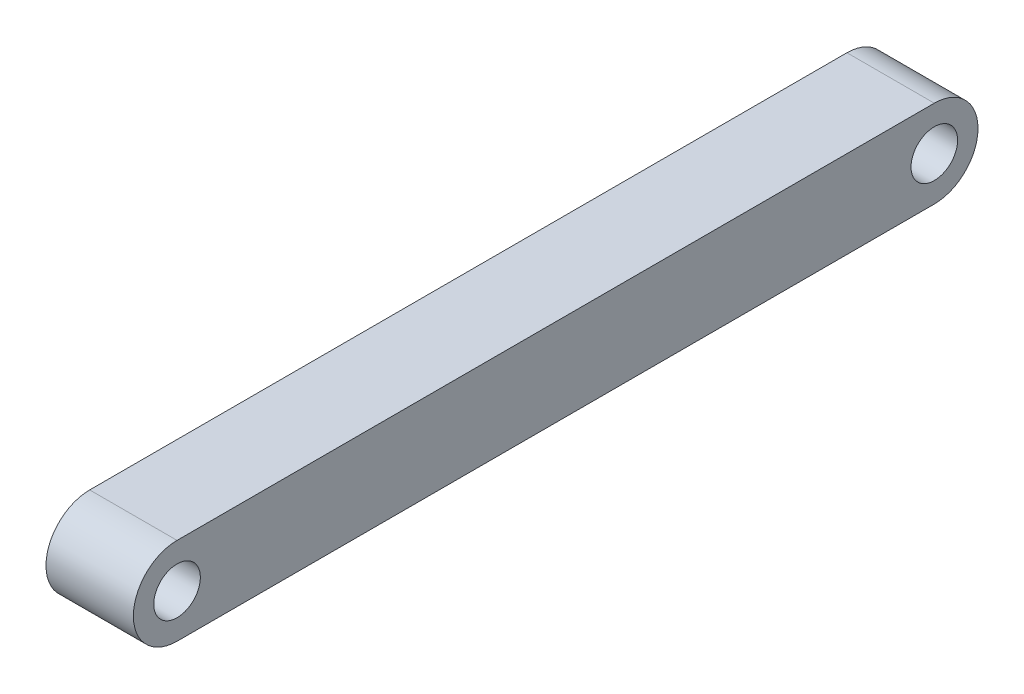
ISO-10303-21;
HEADER;
FILE_DESCRIPTION(('STEP AP214'),'2;1');
FILE_NAME('part.step','',(''),(''),'','','');
FILE_SCHEMA(('AUTOMOTIVE_DESIGN { 1 0 10303 214 1 1 1 1 }'));
ENDSEC;
DATA;
#1=APPLICATION_CONTEXT('core data for automotive mechanical design processes');
#2=APPLICATION_PROTOCOL_DEFINITION('international standard','automotive_design',2000,#1);
#3=PRODUCT_CONTEXT('',#1,'mechanical');
#4=PRODUCT('Part','Part','',(#3));
#5=PRODUCT_RELATED_PRODUCT_CATEGORY('part','',(#4));
#6=PRODUCT_DEFINITION_FORMATION('','',#4);
#7=PRODUCT_DEFINITION_CONTEXT('part definition',#1,'design');
#8=PRODUCT_DEFINITION('design','',#6,#7);
#9=PRODUCT_DEFINITION_SHAPE('','',#8);
#10=(LENGTH_UNIT() NAMED_UNIT(*) SI_UNIT(.MILLI.,.METRE.));
#11=(NAMED_UNIT(*) PLANE_ANGLE_UNIT() SI_UNIT($,.RADIAN.));
#12=(NAMED_UNIT(*) SI_UNIT($,.STERADIAN.) SOLID_ANGLE_UNIT());
#13=UNCERTAINTY_MEASURE_WITH_UNIT(LENGTH_MEASURE(1.E-05),#10,'distance_accuracy_value','');
#14=(GEOMETRIC_REPRESENTATION_CONTEXT(3) GLOBAL_UNCERTAINTY_ASSIGNED_CONTEXT((#13)) GLOBAL_UNIT_ASSIGNED_CONTEXT((#10,
#11,#12)) REPRESENTATION_CONTEXT('',''));
#15=CARTESIAN_POINT('',(0.,0.,0.));
#16=DIRECTION('',(0.,0.,1.));
#17=DIRECTION('',(1.,0.,0.));
#18=AXIS2_PLACEMENT_3D('',#15,#16,#17);
#19=CARTESIAN_POINT('',(7.5,0.,65.));
#20=DIRECTION('',(1.,0.,0.));
#21=DIRECTION('',(0.,0.,-1.));
#22=AXIS2_PLACEMENT_3D('',#19,#20,#21);
#23=PLANE('',#22);
#24=CARTESIAN_POINT('',(7.5,0.,65.));
#25=DIRECTION('',(1.,0.,0.));
#26=DIRECTION('',(0.,0.,-1.));
#27=AXIS2_PLACEMENT_3D('',#24,#25,#26);
#28=CIRCLE('',#27,4.);
#29=CARTESIAN_POINT('',(7.5,0.,61.));
#30=VERTEX_POINT('',#29);
#31=EDGE_CURVE('E112',#30,#30,#28,.T.);
#32=ORIENTED_EDGE('',*,*,#31,.F.);
#33=EDGE_LOOP('',(#32));
#34=FACE_BOUND('',#33,.T.);
#35=CARTESIAN_POINT('',(7.5,0.,65.));
#36=DIRECTION('',(1.,0.,0.));
#37=DIRECTION('',(0.,0.,-1.));
#38=AXIS2_PLACEMENT_3D('',#35,#36,#37);
#39=CIRCLE('',#38,7.5);
#40=CARTESIAN_POINT('',(7.5,7.5,65.));
#41=VERTEX_POINT('',#40);
#42=CARTESIAN_POINT('',(7.5,-7.5,65.));
#43=VERTEX_POINT('',#42);
#44=EDGE_CURVE('E92',#41,#43,#39,.T.);
#45=ORIENTED_EDGE('',*,*,#44,.T.);
#46=DIRECTION('',(0.,0.,-1.));
#47=VECTOR('',#46,1.);
#48=CARTESIAN_POINT('',(7.5,-7.5,65.));
#49=LINE('',#48,#47);
#50=CARTESIAN_POINT('',(7.5,-7.49999999999998,-65.));
#51=VERTEX_POINT('',#50);
#52=EDGE_CURVE('E87',#43,#51,#49,.T.);
#53=ORIENTED_EDGE('',*,*,#52,.T.);
#54=CARTESIAN_POINT('',(7.5,0.,-65.));
#55=DIRECTION('',(1.,0.,0.));
#56=DIRECTION('',(0.,0.,-1.));
#57=AXIS2_PLACEMENT_3D('',#54,#55,#56);
#58=CIRCLE('',#57,7.5);
#59=CARTESIAN_POINT('',(7.5,7.50000000000002,-65.));
#60=VERTEX_POINT('',#59);
#61=EDGE_CURVE('E90',#51,#60,#58,.T.);
#62=ORIENTED_EDGE('',*,*,#61,.T.);
#63=DIRECTION('',(0.,0.,1.));
#64=VECTOR('',#63,1.);
#65=CARTESIAN_POINT('',(7.5,7.5,65.));
#66=LINE('',#65,#64);
#67=EDGE_CURVE('E57',#60,#41,#66,.T.);
#68=ORIENTED_EDGE('',*,*,#67,.T.);
#69=EDGE_LOOP('',(#45,#53,#62,#68));
#70=FACE_BOUND('',#69,.T.);
#71=CARTESIAN_POINT('',(7.5,0.,-65.));
#72=DIRECTION('',(1.,0.,0.));
#73=DIRECTION('',(0.,0.,-1.));
#74=AXIS2_PLACEMENT_3D('',#71,#72,#73);
#75=CIRCLE('',#74,4.00000000000001);
#76=CARTESIAN_POINT('',(7.5,0.,-69.));
#77=VERTEX_POINT('',#76);
#78=EDGE_CURVE('E134',#77,#77,#75,.T.);
#79=ORIENTED_EDGE('',*,*,#78,.F.);
#80=EDGE_LOOP('',(#79));
#81=FACE_BOUND('',#80,.T.);
#82=ADVANCED_FACE('F39',(#34,#70,#81),#23,.T.);
#83=CARTESIAN_POINT('',(-7.5,0.,65.));
#84=DIRECTION('',(1.,0.,0.));
#85=DIRECTION('',(0.,0.,-1.));
#86=AXIS2_PLACEMENT_3D('',#83,#84,#85);
#87=PLANE('',#86);
#88=CARTESIAN_POINT('',(-7.5,0.,65.));
#89=DIRECTION('',(1.,0.,0.));
#90=DIRECTION('',(0.,0.,-1.));
#91=AXIS2_PLACEMENT_3D('',#88,#89,#90);
#92=CIRCLE('',#91,7.5);
#93=CARTESIAN_POINT('',(-7.5,7.5,65.));
#94=VERTEX_POINT('',#93);
#95=CARTESIAN_POINT('',(-7.5,-7.5,65.));
#96=VERTEX_POINT('',#95);
#97=EDGE_CURVE('E108',#94,#96,#92,.T.);
#98=ORIENTED_EDGE('',*,*,#97,.F.);
#99=DIRECTION('',(0.,0.,1.));
#100=VECTOR('',#99,1.);
#101=CARTESIAN_POINT('',(-7.5,7.5,65.));
#102=LINE('',#101,#100);
#103=CARTESIAN_POINT('',(-7.5,7.50000000000002,-65.));
#104=VERTEX_POINT('',#103);
#105=EDGE_CURVE('E80',#104,#94,#102,.T.);
#106=ORIENTED_EDGE('',*,*,#105,.F.);
#107=CARTESIAN_POINT('',(-7.5,0.,-65.));
#108=DIRECTION('',(1.,0.,0.));
#109=DIRECTION('',(0.,0.,-1.));
#110=AXIS2_PLACEMENT_3D('',#107,#108,#109);
#111=CIRCLE('',#110,7.5);
#112=CARTESIAN_POINT('',(-7.5,-7.49999999999998,-65.));
#113=VERTEX_POINT('',#112);
#114=EDGE_CURVE('E74',#113,#104,#111,.T.);
#115=ORIENTED_EDGE('',*,*,#114,.F.);
#116=DIRECTION('',(0.,0.,-1.));
#117=VECTOR('',#116,1.);
#118=CARTESIAN_POINT('',(-7.5,-7.5,65.));
#119=LINE('',#118,#117);
#120=EDGE_CURVE('E97',#96,#113,#119,.T.);
#121=ORIENTED_EDGE('',*,*,#120,.F.);
#122=EDGE_LOOP('',(#98,#106,#115,#121));
#123=FACE_BOUND('',#122,.T.);
#124=CARTESIAN_POINT('',(-7.5,0.,65.));
#125=DIRECTION('',(1.,0.,0.));
#126=DIRECTION('',(0.,0.,-1.));
#127=AXIS2_PLACEMENT_3D('',#124,#125,#126);
#128=CIRCLE('',#127,4.);
#129=CARTESIAN_POINT('',(-7.5,0.,61.));
#130=VERTEX_POINT('',#129);
#131=EDGE_CURVE('E130',#130,#130,#128,.T.);
#132=ORIENTED_EDGE('',*,*,#131,.T.);
#133=EDGE_LOOP('',(#132));
#134=FACE_BOUND('',#133,.T.);
#135=CARTESIAN_POINT('',(-7.5,0.,-65.));
#136=DIRECTION('',(1.,0.,0.));
#137=DIRECTION('',(0.,0.,-1.));
#138=AXIS2_PLACEMENT_3D('',#135,#136,#137);
#139=CIRCLE('',#138,4.00000000000001);
#140=CARTESIAN_POINT('',(-7.5,0.,-69.));
#141=VERTEX_POINT('',#140);
#142=EDGE_CURVE('E138',#141,#141,#139,.T.);
#143=ORIENTED_EDGE('',*,*,#142,.T.);
#144=EDGE_LOOP('',(#143));
#145=FACE_BOUND('',#144,.T.);
#146=ADVANCED_FACE('F125',(#123,#134,#145),#87,.F.);
#147=CARTESIAN_POINT('',(7.5,0.,65.));
#148=DIRECTION('',(-1.,0.,0.));
#149=DIRECTION('',(0.,0.,1.));
#150=AXIS2_PLACEMENT_3D('',#147,#148,#149);
#151=CYLINDRICAL_SURFACE('',#150,7.5);
#152=ORIENTED_EDGE('',*,*,#97,.T.);
#153=DIRECTION('',(-1.,0.,0.));
#154=VECTOR('',#153,1.);
#155=CARTESIAN_POINT('',(7.5,-7.5,65.));
#156=LINE('',#155,#154);
#157=EDGE_CURVE('E11',#43,#96,#156,.T.);
#158=ORIENTED_EDGE('',*,*,#157,.F.);
#159=ORIENTED_EDGE('',*,*,#44,.F.);
#160=DIRECTION('',(-1.,0.,0.));
#161=VECTOR('',#160,1.);
#162=CARTESIAN_POINT('',(7.5,7.5,65.));
#163=LINE('',#162,#161);
#164=EDGE_CURVE('E104',#41,#94,#163,.T.);
#165=ORIENTED_EDGE('',*,*,#164,.T.);
#166=EDGE_LOOP('',(#152,#158,#159,#165));
#167=FACE_BOUND('',#166,.T.);
#168=ADVANCED_FACE('F41',(#167),#151,.T.);
#169=CARTESIAN_POINT('',(7.5,-7.5,65.));
#170=DIRECTION('',(0.,1.,0.));
#171=DIRECTION('',(0.,0.,1.));
#172=AXIS2_PLACEMENT_3D('',#169,#170,#171);
#173=PLANE('',#172);
#174=ORIENTED_EDGE('',*,*,#120,.T.);
#175=DIRECTION('',(-1.,0.,0.));
#176=VECTOR('',#175,1.);
#177=CARTESIAN_POINT('',(7.5,-7.49999999999998,-65.));
#178=LINE('',#177,#176);
#179=EDGE_CURVE('E49',#51,#113,#178,.T.);
#180=ORIENTED_EDGE('',*,*,#179,.F.);
#181=ORIENTED_EDGE('',*,*,#52,.F.);
#182=ORIENTED_EDGE('',*,*,#157,.T.);
#183=EDGE_LOOP('',(#174,#180,#181,#182));
#184=FACE_BOUND('',#183,.T.);
#185=ADVANCED_FACE('F96',(#184),#173,.F.);
#186=CARTESIAN_POINT('',(7.5,0.,-65.));
#187=DIRECTION('',(-1.,0.,0.));
#188=DIRECTION('',(0.,0.,1.));
#189=AXIS2_PLACEMENT_3D('',#186,#187,#188);
#190=CYLINDRICAL_SURFACE('',#189,7.5);
#191=ORIENTED_EDGE('',*,*,#114,.T.);
#192=DIRECTION('',(-1.,0.,0.));
#193=VECTOR('',#192,1.);
#194=CARTESIAN_POINT('',(7.5,7.50000000000002,-65.));
#195=LINE('',#194,#193);
#196=EDGE_CURVE('E99',#60,#104,#195,.T.);
#197=ORIENTED_EDGE('',*,*,#196,.F.);
#198=ORIENTED_EDGE('',*,*,#61,.F.);
#199=ORIENTED_EDGE('',*,*,#179,.T.);
#200=EDGE_LOOP('',(#191,#197,#198,#199));
#201=FACE_BOUND('',#200,.T.);
#202=ADVANCED_FACE('F100',(#201),#190,.T.);
#203=CARTESIAN_POINT('',(7.5,7.5,65.));
#204=DIRECTION('',(0.,-1.,0.));
#205=DIRECTION('',(0.,0.,-1.));
#206=AXIS2_PLACEMENT_3D('',#203,#204,#205);
#207=PLANE('',#206);
#208=ORIENTED_EDGE('',*,*,#105,.T.);
#209=ORIENTED_EDGE('',*,*,#164,.F.);
#210=ORIENTED_EDGE('',*,*,#67,.F.);
#211=ORIENTED_EDGE('',*,*,#196,.T.);
#212=EDGE_LOOP('',(#208,#209,#210,#211));
#213=FACE_BOUND('',#212,.T.);
#214=ADVANCED_FACE('F122',(#213),#207,.F.);
#215=CARTESIAN_POINT('',(7.5,0.,65.));
#216=DIRECTION('',(-1.,0.,0.));
#217=DIRECTION('',(0.,0.,1.));
#218=AXIS2_PLACEMENT_3D('',#215,#216,#217);
#219=CYLINDRICAL_SURFACE('',#218,4.);
#220=ORIENTED_EDGE('',*,*,#31,.T.);
#221=EDGE_LOOP('',(#220));
#222=FACE_BOUND('',#221,.T.);
#223=ORIENTED_EDGE('',*,*,#131,.F.);
#224=EDGE_LOOP('',(#223));
#225=FACE_BOUND('',#224,.T.);
#226=ADVANCED_FACE('F157',(#222,#225),#219,.F.);
#227=CARTESIAN_POINT('',(7.5,0.,-65.));
#228=DIRECTION('',(-1.,0.,0.));
#229=DIRECTION('',(0.,0.,1.));
#230=AXIS2_PLACEMENT_3D('',#227,#228,#229);
#231=CYLINDRICAL_SURFACE('',#230,4.00000000000001);
#232=ORIENTED_EDGE('',*,*,#78,.T.);
#233=EDGE_LOOP('',(#232));
#234=FACE_BOUND('',#233,.T.);
#235=ORIENTED_EDGE('',*,*,#142,.F.);
#236=EDGE_LOOP('',(#235));
#237=FACE_BOUND('',#236,.T.);
#238=ADVANCED_FACE('F146',(#234,#237),#231,.F.);
#239=CLOSED_SHELL('',(#82,#146,#168,#185,#202,#214,#226,#238));
#240=MANIFOLD_SOLID_BREP('B2',#239);
#241=ADVANCED_BREP_SHAPE_REPRESENTATION('',(#18,#240),#14);
#242=SHAPE_DEFINITION_REPRESENTATION(#9,#241);
ENDSEC;
END-ISO-10303-21;
